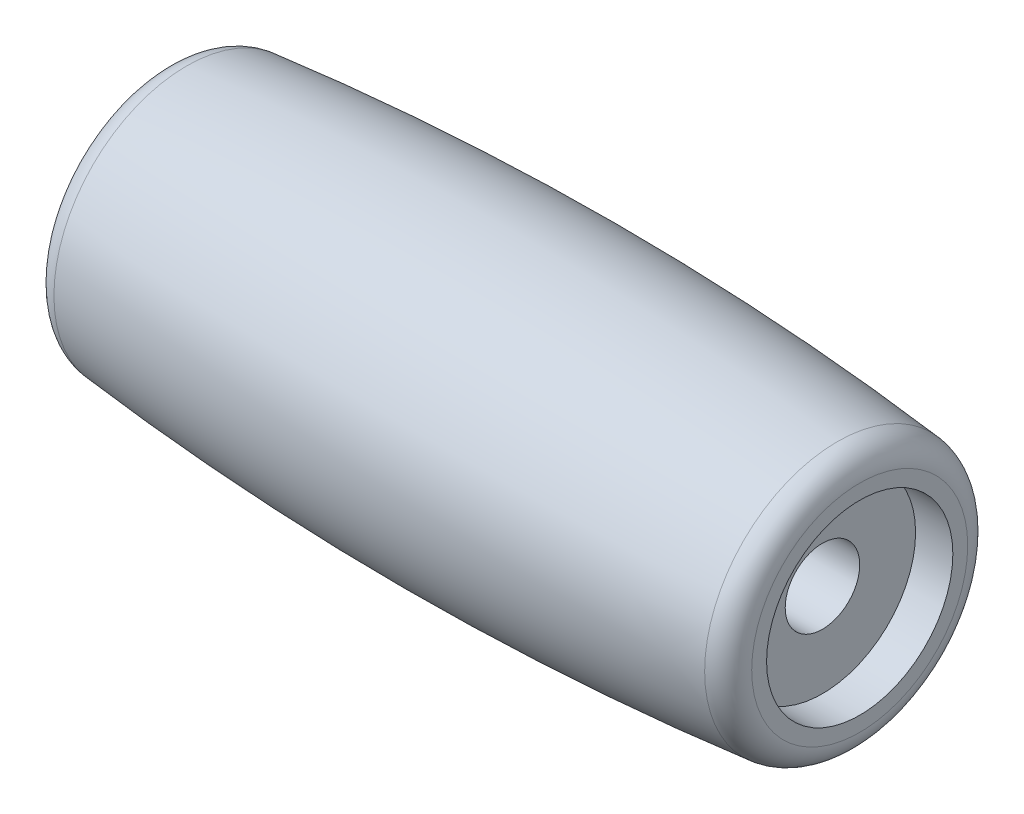
ISO-10303-21;
HEADER;
FILE_DESCRIPTION(('STEP AP214'),'2;1');
FILE_NAME('part.step','',(''),(''),'','','');
FILE_SCHEMA(('AUTOMOTIVE_DESIGN { 1 0 10303 214 1 1 1 1 }'));
ENDSEC;
DATA;
#1=APPLICATION_CONTEXT('core data for automotive mechanical design processes');
#2=APPLICATION_PROTOCOL_DEFINITION('international standard','automotive_design',2000,#1);
#3=PRODUCT_CONTEXT('',#1,'mechanical');
#4=PRODUCT('Part','Part','',(#3));
#5=PRODUCT_RELATED_PRODUCT_CATEGORY('part','',(#4));
#6=PRODUCT_DEFINITION_FORMATION('','',#4);
#7=PRODUCT_DEFINITION_CONTEXT('part definition',#1,'design');
#8=PRODUCT_DEFINITION('design','',#6,#7);
#9=PRODUCT_DEFINITION_SHAPE('','',#8);
#10=(LENGTH_UNIT() NAMED_UNIT(*) SI_UNIT(.MILLI.,.METRE.));
#11=(NAMED_UNIT(*) PLANE_ANGLE_UNIT() SI_UNIT($,.RADIAN.));
#12=(NAMED_UNIT(*) SI_UNIT($,.STERADIAN.) SOLID_ANGLE_UNIT());
#13=UNCERTAINTY_MEASURE_WITH_UNIT(LENGTH_MEASURE(1.E-05),#10,'distance_accuracy_value','');
#14=(GEOMETRIC_REPRESENTATION_CONTEXT(3) GLOBAL_UNCERTAINTY_ASSIGNED_CONTEXT((#13)) GLOBAL_UNIT_ASSIGNED_CONTEXT((#10,
#11,#12)) REPRESENTATION_CONTEXT('',''));
#15=CARTESIAN_POINT('',(0.,0.,0.));
#16=DIRECTION('',(0.,0.,1.));
#17=DIRECTION('',(1.,0.,0.));
#18=AXIS2_PLACEMENT_3D('',#15,#16,#17);
#19=CARTESIAN_POINT('',(0.,0.,0.));
#20=DIRECTION('',(-1.,0.,0.));
#21=DIRECTION('',(0.,0.,1.));
#22=AXIS2_PLACEMENT_3D('',#19,#20,#21);
#23=CYLINDRICAL_SURFACE('',#22,3.75);
#24=CARTESIAN_POINT('',(-12.5,0.,0.));
#25=DIRECTION('',(-1.,0.,0.));
#26=DIRECTION('',(0.,0.,1.));
#27=AXIS2_PLACEMENT_3D('',#24,#25,#26);
#28=CIRCLE('',#27,3.75);
#29=CARTESIAN_POINT('',(-12.5,0.,3.75));
#30=VERTEX_POINT('',#29);
#31=EDGE_CURVE('E67',#30,#30,#28,.T.);
#32=ORIENTED_EDGE('',*,*,#31,.F.);
#33=EDGE_LOOP('',(#32));
#34=FACE_BOUND('',#33,.T.);
#35=CARTESIAN_POINT('',(-14.,0.,0.));
#36=DIRECTION('',(-1.,0.,0.));
#37=DIRECTION('',(0.,0.,1.));
#38=AXIS2_PLACEMENT_3D('',#35,#36,#37);
#39=CIRCLE('',#38,3.75);
#40=CARTESIAN_POINT('',(-14.,0.,3.75));
#41=VERTEX_POINT('',#40);
#42=EDGE_CURVE('E10',#41,#41,#39,.T.);
#43=ORIENTED_EDGE('',*,*,#42,.T.);
#44=EDGE_LOOP('',(#43));
#45=FACE_BOUND('',#44,.T.);
#46=ADVANCED_FACE('F33',(#34,#45),#23,.F.);
#47=CARTESIAN_POINT('',(-14.,3.75,0.));
#48=DIRECTION('',(1.,0.,0.));
#49=DIRECTION('',(0.,0.,-1.));
#50=AXIS2_PLACEMENT_3D('',#47,#48,#49);
#51=PLANE('',#50);
#52=ORIENTED_EDGE('',*,*,#42,.F.);
#53=EDGE_LOOP('',(#52));
#54=FACE_BOUND('',#53,.T.);
#55=CARTESIAN_POINT('',(-14.,0.,0.));
#56=DIRECTION('',(-1.,0.,0.));
#57=DIRECTION('',(0.,0.,1.));
#58=AXIS2_PLACEMENT_3D('',#55,#56,#57);
#59=CIRCLE('',#58,4.34857666506388);
#60=CARTESIAN_POINT('',(-14.,0.,4.34857666506388));
#61=VERTEX_POINT('',#60);
#62=EDGE_CURVE('E39',#61,#61,#59,.T.);
#63=ORIENTED_EDGE('',*,*,#62,.T.);
#64=EDGE_LOOP('',(#63));
#65=FACE_BOUND('',#64,.T.);
#66=ADVANCED_FACE('F74',(#54,#65),#51,.F.);
#67=CARTESIAN_POINT('',(-13.,0.,0.));
#68=DIRECTION('',(-1.,0.,0.));
#69=DIRECTION('',(0.,0.,1.));
#70=AXIS2_PLACEMENT_3D('',#67,#68,#69);
#71=TOROIDAL_SURFACE('',#70,4.34857666506388,1.00000000000002);
#72=ORIENTED_EDGE('',*,*,#62,.F.);
#73=EDGE_LOOP('',(#72));
#74=FACE_BOUND('',#73,.T.);
#75=CARTESIAN_POINT('',(-13.0999679589875,0.,0.));
#76=DIRECTION('',(-1.,0.,0.));
#77=DIRECTION('',(0.,0.,1.));
#78=AXIS2_PLACEMENT_3D('',#75,#76,#77);
#79=CIRCLE('',#78,5.34356732189233);
#80=CARTESIAN_POINT('',(-13.0999679589875,0.,5.34356732189233));
#81=VERTEX_POINT('',#80);
#82=EDGE_CURVE('E43',#81,#81,#79,.T.);
#83=ORIENTED_EDGE('',*,*,#82,.T.);
#84=EDGE_LOOP('',(#83));
#85=FACE_BOUND('',#84,.T.);
#86=ADVANCED_FACE('F78',(#74,#85),#71,.T.);
#87=CARTESIAN_POINT('',(0.,0.,0.));
#88=DIRECTION('',(-1.,0.,0.));
#89=DIRECTION('',(0.,0.,1.));
#90=AXIS2_PLACEMENT_3D('',#87,#88,#89);
#91=DEGENERATE_TOROIDAL_SURFACE('',#90,125.041666666666,131.041666666666,.F.);
#92=ORIENTED_EDGE('',*,*,#82,.F.);
#93=EDGE_LOOP('',(#92));
#94=FACE_BOUND('',#93,.T.);
#95=CARTESIAN_POINT('',(13.0999679589875,0.,0.));
#96=DIRECTION('',(-1.,0.,0.));
#97=DIRECTION('',(0.,0.,1.));
#98=AXIS2_PLACEMENT_3D('',#95,#96,#97);
#99=CIRCLE('',#98,5.34356732189234);
#100=CARTESIAN_POINT('',(13.0999679589875,0.,5.34356732189234));
#101=VERTEX_POINT('',#100);
#102=EDGE_CURVE('E47',#101,#101,#99,.T.);
#103=ORIENTED_EDGE('',*,*,#102,.T.);
#104=EDGE_LOOP('',(#103));
#105=FACE_BOUND('',#104,.T.);
#106=ADVANCED_FACE('F83',(#94,#105),#91,.F.);
#107=CARTESIAN_POINT('',(13.,0.,0.));
#108=DIRECTION('',(-1.,0.,0.));
#109=DIRECTION('',(0.,0.,1.));
#110=AXIS2_PLACEMENT_3D('',#107,#108,#109);
#111=TOROIDAL_SURFACE('',#110,4.34857666506389,1.00000000000002);
#112=ORIENTED_EDGE('',*,*,#102,.F.);
#113=EDGE_LOOP('',(#112));
#114=FACE_BOUND('',#113,.T.);
#115=CARTESIAN_POINT('',(14.,0.,0.));
#116=DIRECTION('',(-1.,0.,0.));
#117=DIRECTION('',(0.,0.,1.));
#118=AXIS2_PLACEMENT_3D('',#115,#116,#117);
#119=CIRCLE('',#118,4.34857666506389);
#120=CARTESIAN_POINT('',(14.,0.,4.34857666506389));
#121=VERTEX_POINT('',#120);
#122=EDGE_CURVE('E52',#121,#121,#119,.T.);
#123=ORIENTED_EDGE('',*,*,#122,.T.);
#124=EDGE_LOOP('',(#123));
#125=FACE_BOUND('',#124,.T.);
#126=ADVANCED_FACE('F89',(#114,#125),#111,.T.);
#127=CARTESIAN_POINT('',(14.,3.75,0.));
#128=DIRECTION('',(-1.,0.,0.));
#129=DIRECTION('',(0.,0.,1.));
#130=AXIS2_PLACEMENT_3D('',#127,#128,#129);
#131=PLANE('',#130);
#132=ORIENTED_EDGE('',*,*,#122,.F.);
#133=EDGE_LOOP('',(#132));
#134=FACE_BOUND('',#133,.T.);
#135=CARTESIAN_POINT('',(14.,0.,0.));
#136=DIRECTION('',(-1.,0.,0.));
#137=DIRECTION('',(0.,0.,1.));
#138=AXIS2_PLACEMENT_3D('',#135,#136,#137);
#139=CIRCLE('',#138,3.75);
#140=CARTESIAN_POINT('',(14.,0.,3.75));
#141=VERTEX_POINT('',#140);
#142=EDGE_CURVE('E55',#141,#141,#139,.T.);
#143=ORIENTED_EDGE('',*,*,#142,.T.);
#144=EDGE_LOOP('',(#143));
#145=FACE_BOUND('',#144,.T.);
#146=ADVANCED_FACE('F93',(#134,#145),#131,.F.);
#147=CARTESIAN_POINT('',(0.,0.,0.));
#148=DIRECTION('',(-1.,0.,0.));
#149=DIRECTION('',(0.,0.,1.));
#150=AXIS2_PLACEMENT_3D('',#147,#148,#149);
#151=CYLINDRICAL_SURFACE('',#150,3.75);
#152=ORIENTED_EDGE('',*,*,#142,.F.);
#153=EDGE_LOOP('',(#152));
#154=FACE_BOUND('',#153,.T.);
#155=CARTESIAN_POINT('',(12.5,0.,0.));
#156=DIRECTION('',(-1.,0.,0.));
#157=DIRECTION('',(0.,0.,1.));
#158=AXIS2_PLACEMENT_3D('',#155,#156,#157);
#159=CIRCLE('',#158,3.75);
#160=CARTESIAN_POINT('',(12.5,0.,3.75));
#161=VERTEX_POINT('',#160);
#162=EDGE_CURVE('E58',#161,#161,#159,.T.);
#163=ORIENTED_EDGE('',*,*,#162,.T.);
#164=EDGE_LOOP('',(#163));
#165=FACE_BOUND('',#164,.T.);
#166=ADVANCED_FACE('F97',(#154,#165),#151,.F.);
#167=CARTESIAN_POINT('',(12.5,1.5,0.));
#168=DIRECTION('',(-1.,0.,0.));
#169=DIRECTION('',(0.,0.,1.));
#170=AXIS2_PLACEMENT_3D('',#167,#168,#169);
#171=PLANE('',#170);
#172=ORIENTED_EDGE('',*,*,#162,.F.);
#173=EDGE_LOOP('',(#172));
#174=FACE_BOUND('',#173,.T.);
#175=CARTESIAN_POINT('',(12.5,0.,0.));
#176=DIRECTION('',(-1.,0.,0.));
#177=DIRECTION('',(0.,0.,1.));
#178=AXIS2_PLACEMENT_3D('',#175,#176,#177);
#179=CIRCLE('',#178,1.5);
#180=CARTESIAN_POINT('',(12.5,0.,1.5));
#181=VERTEX_POINT('',#180);
#182=EDGE_CURVE('E61',#181,#181,#179,.T.);
#183=ORIENTED_EDGE('',*,*,#182,.T.);
#184=EDGE_LOOP('',(#183));
#185=FACE_BOUND('',#184,.T.);
#186=ADVANCED_FACE('F101',(#174,#185),#171,.F.);
#187=CARTESIAN_POINT('',(0.,0.,0.));
#188=DIRECTION('',(-1.,0.,0.));
#189=DIRECTION('',(0.,0.,1.));
#190=AXIS2_PLACEMENT_3D('',#187,#188,#189);
#191=CYLINDRICAL_SURFACE('',#190,1.5);
#192=ORIENTED_EDGE('',*,*,#182,.F.);
#193=EDGE_LOOP('',(#192));
#194=FACE_BOUND('',#193,.T.);
#195=CARTESIAN_POINT('',(-12.5,0.,0.));
#196=DIRECTION('',(-1.,0.,0.));
#197=DIRECTION('',(0.,0.,1.));
#198=AXIS2_PLACEMENT_3D('',#195,#196,#197);
#199=CIRCLE('',#198,1.5);
#200=CARTESIAN_POINT('',(-12.5,0.,1.5));
#201=VERTEX_POINT('',#200);
#202=EDGE_CURVE('E64',#201,#201,#199,.T.);
#203=ORIENTED_EDGE('',*,*,#202,.T.);
#204=EDGE_LOOP('',(#203));
#205=FACE_BOUND('',#204,.T.);
#206=ADVANCED_FACE('F105',(#194,#205),#191,.F.);
#207=CARTESIAN_POINT('',(-12.5,1.5,0.));
#208=DIRECTION('',(1.,0.,0.));
#209=DIRECTION('',(0.,0.,-1.));
#210=AXIS2_PLACEMENT_3D('',#207,#208,#209);
#211=PLANE('',#210);
#212=ORIENTED_EDGE('',*,*,#202,.F.);
#213=EDGE_LOOP('',(#212));
#214=FACE_BOUND('',#213,.T.);
#215=ORIENTED_EDGE('',*,*,#31,.T.);
#216=EDGE_LOOP('',(#215));
#217=FACE_BOUND('',#216,.T.);
#218=ADVANCED_FACE('F71',(#214,#217),#211,.F.);
#219=CLOSED_SHELL('',(#46,#66,#86,#106,#126,#146,#166,#186,#206,#218));
#220=MANIFOLD_SOLID_BREP('B2',#219);
#221=ADVANCED_BREP_SHAPE_REPRESENTATION('',(#18,#220),#14);
#222=SHAPE_DEFINITION_REPRESENTATION(#9,#221);
ENDSEC;
END-ISO-10303-21;
